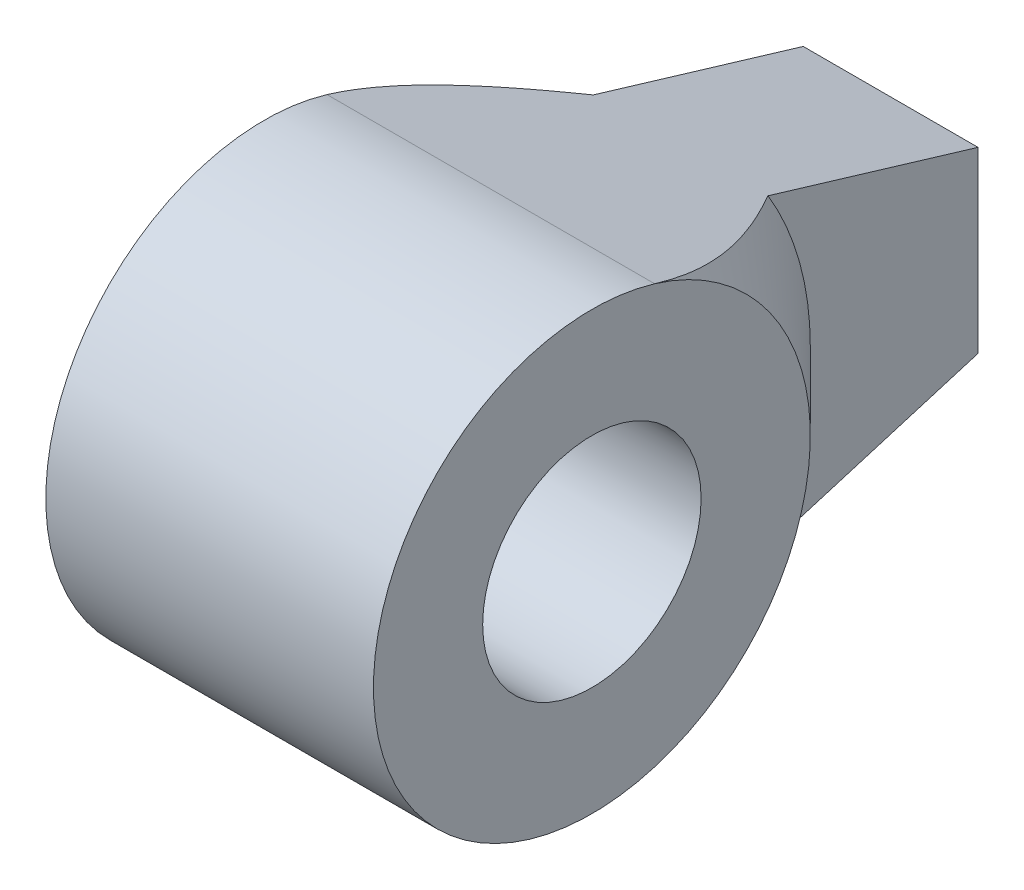
ISO-10303-21;
HEADER;
FILE_DESCRIPTION(('STEP AP214'),'2;1');
FILE_NAME('part.step','',(''),(''),'','','');
FILE_SCHEMA(('AUTOMOTIVE_DESIGN { 1 0 10303 214 1 1 1 1 }'));
ENDSEC;
DATA;
#1=APPLICATION_CONTEXT('core data for automotive mechanical design processes');
#2=APPLICATION_PROTOCOL_DEFINITION('international standard','automotive_design',2000,#1);
#3=PRODUCT_CONTEXT('',#1,'mechanical');
#4=PRODUCT('Part','Part','',(#3));
#5=PRODUCT_RELATED_PRODUCT_CATEGORY('part','',(#4));
#6=PRODUCT_DEFINITION_FORMATION('','',#4);
#7=PRODUCT_DEFINITION_CONTEXT('part definition',#1,'design');
#8=PRODUCT_DEFINITION('design','',#6,#7);
#9=PRODUCT_DEFINITION_SHAPE('','',#8);
#10=(LENGTH_UNIT() NAMED_UNIT(*) SI_UNIT(.MILLI.,.METRE.));
#11=(NAMED_UNIT(*) PLANE_ANGLE_UNIT() SI_UNIT($,.RADIAN.));
#12=(NAMED_UNIT(*) SI_UNIT($,.STERADIAN.) SOLID_ANGLE_UNIT());
#13=UNCERTAINTY_MEASURE_WITH_UNIT(LENGTH_MEASURE(1.E-05),#10,'distance_accuracy_value','');
#14=(GEOMETRIC_REPRESENTATION_CONTEXT(3) GLOBAL_UNCERTAINTY_ASSIGNED_CONTEXT((#13)) GLOBAL_UNIT_ASSIGNED_CONTEXT((#10,
#11,#12)) REPRESENTATION_CONTEXT('',''));
#15=CARTESIAN_POINT('',(0.,0.,0.));
#16=DIRECTION('',(0.,0.,1.));
#17=DIRECTION('',(1.,0.,0.));
#18=AXIS2_PLACEMENT_3D('',#15,#16,#17);
#19=CARTESIAN_POINT('',(8.,0.,0.));
#20=DIRECTION('',(1.,0.,0.));
#21=DIRECTION('',(0.,0.,-1.));
#22=AXIS2_PLACEMENT_3D('',#19,#20,#21);
#23=PLANE('',#22);
#24=DIRECTION('',(0.,-0.287413603137363,-0.957806567492413));
#25=VECTOR('',#24,1.);
#26=CARTESIAN_POINT('',(8.,19.1561313498482,-5.74827206274726));
#27=LINE('',#26,#25);
#28=CARTESIAN_POINT('',(8.,13.9429207671742,-23.1213096618747));
#29=VERTEX_POINT('',#28);
#30=CARTESIAN_POINT('',(8.,8.17227543179107,-42.352));
#31=VERTEX_POINT('',#30);
#32=EDGE_CURVE('E155',#29,#31,#27,.T.);
#33=ORIENTED_EDGE('',*,*,#32,.F.);
#34=CARTESIAN_POINT('',(8.,0.,0.));
#35=DIRECTION('',(1.,0.,0.));
#36=DIRECTION('',(0.,0.,-1.));
#37=AXIS2_PLACEMENT_3D('',#34,#35,#36);
#38=CIRCLE('',#37,27.);
#39=CARTESIAN_POINT('',(8.,-13.9429207671742,-23.1213096618748));
#40=VERTEX_POINT('',#39);
#41=EDGE_CURVE('E192',#29,#40,#38,.F.);
#42=ORIENTED_EDGE('',*,*,#41,.T.);
#43=DIRECTION('',(0.,-0.287413603137363,0.957806567492413));
#44=VECTOR('',#43,1.);
#45=CARTESIAN_POINT('',(8.,-8.17227543179107,-42.352));
#46=LINE('',#45,#44);
#47=CARTESIAN_POINT('',(8.,-8.17227543179107,-42.352));
#48=VERTEX_POINT('',#47);
#49=EDGE_CURVE('E163',#48,#40,#46,.T.);
#50=ORIENTED_EDGE('',*,*,#49,.F.);
#51=DIRECTION('',(0.,1.,0.));
#52=VECTOR('',#51,1.);
#53=CARTESIAN_POINT('',(8.,-8.17227543179107,-42.352));
#54=LINE('',#53,#52);
#55=EDGE_CURVE('E158',#48,#31,#54,.T.);
#56=ORIENTED_EDGE('',*,*,#55,.T.);
#57=EDGE_LOOP('',(#33,#42,#50,#56));
#58=FACE_BOUND('',#57,.T.);
#59=ADVANCED_FACE('F59',(#58),#23,.T.);
#60=CARTESIAN_POINT('',(-8.,0.,0.));
#61=DIRECTION('',(1.,0.,0.));
#62=DIRECTION('',(0.,0.,-1.));
#63=AXIS2_PLACEMENT_3D('',#60,#61,#62);
#64=PLANE('',#63);
#65=DIRECTION('',(0.,-0.287413603137363,0.957806567492413));
#66=VECTOR('',#65,1.);
#67=CARTESIAN_POINT('',(-8.,-8.17227543179107,-42.352));
#68=LINE('',#67,#66);
#69=CARTESIAN_POINT('',(-8.,-8.17227543179107,-42.352));
#70=VERTEX_POINT('',#69);
#71=CARTESIAN_POINT('',(-8.,-13.9429207671743,-23.1213096618746));
#72=VERTEX_POINT('',#71);
#73=EDGE_CURVE('E159',#70,#72,#68,.T.);
#74=ORIENTED_EDGE('',*,*,#73,.T.);
#75=CARTESIAN_POINT('',(-8.,0.,0.));
#76=DIRECTION('',(1.,0.,0.));
#77=DIRECTION('',(0.,0.,-1.));
#78=AXIS2_PLACEMENT_3D('',#75,#76,#77);
#79=CIRCLE('',#78,26.9999999999999);
#80=CARTESIAN_POINT('',(-8.,13.9429207671743,-23.1213096618746));
#81=VERTEX_POINT('',#80);
#82=EDGE_CURVE('E180',#72,#81,#79,.T.);
#83=ORIENTED_EDGE('',*,*,#82,.T.);
#84=DIRECTION('',(0.,-0.287413603137363,-0.957806567492413));
#85=VECTOR('',#84,1.);
#86=CARTESIAN_POINT('',(-8.,19.1561313498482,-5.74827206274726));
#87=LINE('',#86,#85);
#88=CARTESIAN_POINT('',(-8.,8.17227543179107,-42.352));
#89=VERTEX_POINT('',#88);
#90=EDGE_CURVE('E149',#81,#89,#87,.T.);
#91=ORIENTED_EDGE('',*,*,#90,.T.);
#92=DIRECTION('',(0.,1.,0.));
#93=VECTOR('',#92,1.);
#94=CARTESIAN_POINT('',(-8.,-8.17227543179107,-42.352));
#95=LINE('',#94,#93);
#96=EDGE_CURVE('E170',#70,#89,#95,.T.);
#97=ORIENTED_EDGE('',*,*,#96,.F.);
#98=EDGE_LOOP('',(#74,#83,#91,#97));
#99=FACE_BOUND('',#98,.T.);
#100=ADVANCED_FACE('F256',(#99),#64,.F.);
#101=CARTESIAN_POINT('',(8.,19.1561313498482,-5.74827206274726));
#102=DIRECTION('',(0.,0.957806567492413,-0.287413603137363));
#103=DIRECTION('',(0.,0.287413603137363,0.957806567492413));
#104=AXIS2_PLACEMENT_3D('',#101,#102,#103);
#105=PLANE('',#104);
#106=ORIENTED_EDGE('',*,*,#90,.F.);
#107=CARTESIAN_POINT('',(-8.,13.9429207671743,-23.1213096618746));
#108=CARTESIAN_POINT('',(-8.30706429240647,14.0743203145086,-22.6834203343391));
#109=CARTESIAN_POINT('',(-8.6098485003343,14.2065608883528,-22.2427282838087));
#110=CARTESIAN_POINT('',(-9.20521595521464,14.4729822755593,-21.3548783295918));
#111=CARTESIAN_POINT('',(-9.49779594548854,14.6071636893576,-20.907718424951));
#112=CARTESIAN_POINT('',(-10.0725755762302,14.8784244957898,-20.0037410937879));
#113=CARTESIAN_POINT('',(-10.3547053708278,15.0155161630769,-19.5468827619529));
#114=CARTESIAN_POINT('',(-10.904508113177,15.292062156689,-18.6252925309963));
#115=CARTESIAN_POINT('',(-11.1721824161888,15.4315162599102,-18.160561375369));
#116=CARTESIAN_POINT('',(-11.6816370859498,15.7082794335001,-17.2382473915812));
#117=CARTESIAN_POINT('',(-11.9239874259006,15.8455011631569,-16.7809556265663));
#118=CARTESIAN_POINT('',(-12.3897467236119,16.1225667613122,-15.8576338121407));
#119=CARTESIAN_POINT('',(-12.6131541259313,16.2624108439881,-15.3916030489835));
#120=CARTESIAN_POINT('',(-13.2489897856156,16.6855639422139,-13.9814442669659));
#121=CARTESIAN_POINT('',(-13.6283593198275,16.9731948721733,-13.0229134572831));
#122=CARTESIAN_POINT('',(-14.1114646998421,17.4177766019297,-11.5413437058881));
#123=CARTESIAN_POINT('',(-14.2598410318007,17.5707644697891,-11.0315112449925));
#124=CARTESIAN_POINT('',(-14.5192158598474,17.8793702623582,-10.0030816520215));
#125=CARTESIAN_POINT('',(-14.6302206725547,18.0349877379312,-9.48448601669519));
#126=CARTESIAN_POINT('',(-14.7662299853021,18.2711846932733,-8.697359058963));
#127=CARTESIAN_POINT('',(-14.8066867637974,18.3510484634706,-8.43121284053556));
#128=CARTESIAN_POINT('',(-14.8764048521142,18.5111819402621,-7.89756761959931));
#129=CARTESIAN_POINT('',(-14.905666435539,18.5914516368872,-7.63006865031276));
#130=CARTESIAN_POINT('',(-14.9526678900106,18.7523797565489,-7.09377527997941));
#131=CARTESIAN_POINT('',(-14.9703919726669,18.8330385607349,-6.82497960875116));
#132=CARTESIAN_POINT('',(-14.9940712806719,18.9945078794712,-6.28688269111763));
#133=CARTESIAN_POINT('',(-15.0000251276921,19.0753184106803,-6.01758138919712));
#134=CARTESIAN_POINT('',(-15.0000000000001,19.1561313498482,-5.74827206274727));
#135=B_SPLINE_CURVE_WITH_KNOTS('',3,(#107,#108,#109,#110,#111,#112,#113,#114,#115,#116,#117,
#118,#119,#120,#121,#122,#123,#124,#125,#126,#127,#128,#129,#130,#131,#132,#133,#134),
.UNSPECIFIED.,.F.,.F.,(4,2,2,2,2,2,2,2,2,2,2,2,2,4),(0.,1.65222291840313,3.30496840668106,
4.96727550771535,6.62942648928656,8.23527712809539,9.84125949896086,13.0449150205177,
14.701633810279,16.3580724369127,17.2002860278251,18.0424790342729,18.8858221228902,
19.7292639635671),.UNSPECIFIED.);
#136=CARTESIAN_POINT('',(-15.,19.1561313498482,-5.74827206274726));
#137=VERTEX_POINT('',#136);
#138=EDGE_CURVE('E203',#81,#137,#135,.T.);
#139=ORIENTED_EDGE('',*,*,#138,.T.);
#140=DIRECTION('',(-1.,0.,0.));
#141=VECTOR('',#140,1.);
#142=CARTESIAN_POINT('',(8.,19.1561313498482,-5.74827206274726));
#143=LINE('',#142,#141);
#144=CARTESIAN_POINT('',(15.,19.1561313498482,-5.74827206274726));
#145=VERTEX_POINT('',#144);
#146=EDGE_CURVE('E177',#145,#137,#143,.T.);
#147=ORIENTED_EDGE('',*,*,#146,.F.);
#148=CARTESIAN_POINT('',(15.,19.1561313498482,-5.74827206274726));
#149=CARTESIAN_POINT('',(15.0000358357359,19.0677422457137,-6.04282897832373));
#150=CARTESIAN_POINT('',(14.9929077189458,18.9793566684735,-6.33737414051576));
#151=CARTESIAN_POINT('',(14.9645898778661,18.8027857745317,-6.92579709614252));
#152=CARTESIAN_POINT('',(14.9434024555946,18.7146004274167,-7.21967499093003));
#153=CARTESIAN_POINT('',(14.8872859080639,18.5387626257111,-7.80565491480524));
#154=CARTESIAN_POINT('',(14.8523831686565,18.4511094741284,-8.09775926662019));
#155=CARTESIAN_POINT('',(14.7693393731644,18.2763260932542,-8.68022533037796));
#156=CARTESIAN_POINT('',(14.7211978739816,18.189195881565,-8.97058698366067));
#157=CARTESIAN_POINT('',(14.5597122685248,17.931812521403,-9.82831768963776));
#158=CARTESIAN_POINT('',(14.4282760654907,17.7624769766191,-10.3926288256924));
#159=CARTESIAN_POINT('',(14.1223859214282,17.4270448989263,-11.5104570824441));
#160=CARTESIAN_POINT('',(13.9479166270376,17.2609495449268,-12.0639702744227));
#161=CARTESIAN_POINT('',(13.5922643436737,16.9578814265131,-13.0739455541089));
#162=CARTESIAN_POINT('',(13.4163356798463,16.8203932370042,-13.5321252972621));
#163=CARTESIAN_POINT('',(13.0418851780683,16.5479667363471,-14.4399873074107));
#164=CARTESIAN_POINT('',(12.8433592809747,16.4130288884091,-14.8896680307569));
#165=CARTESIAN_POINT('',(12.4267030020832,16.1454508731659,-15.7813724508642));
#166=CARTESIAN_POINT('',(12.2085440142716,16.0128144057159,-16.2233838178483));
#167=CARTESIAN_POINT('',(11.7557129780189,15.7498879776708,-17.0995868117219));
#168=CARTESIAN_POINT('',(11.521039635091,15.6195982020299,-17.5337778222507));
#169=CARTESIAN_POINT('',(11.029879314061,15.3570526396449,-18.4087115803378));
#170=CARTESIAN_POINT('',(10.7729340067146,15.2248679212645,-18.8492174923924));
#171=CARTESIAN_POINT('',(10.2462992617282,14.9626056310263,-19.7232072453257));
#172=CARTESIAN_POINT('',(9.97660885381159,14.8325282206122,-20.1566905481934));
#173=CARTESIAN_POINT('',(9.42763181240657,14.5748703604827,-21.0153360260141));
#174=CARTESIAN_POINT('',(9.14839401114667,14.4472812878151,-21.4405269369775));
#175=CARTESIAN_POINT('',(8.5807319380201,14.1938477443786,-22.2850948686157));
#176=CARTESIAN_POINT('',(8.29231008038402,14.0680028274024,-22.7044733762771));
#177=CARTESIAN_POINT('',(8.,13.9429207671742,-23.1213096618748));
#178=B_SPLINE_CURVE_WITH_KNOTS('',3,(#148,#149,#150,#151,#152,#153,#154,#155,#156,#157,#158,
#159,#160,#161,#162,#163,#164,#165,#166,#167,#168,#169,#170,#171,#172,#173,#174,#175,#176,#177),
.UNSPECIFIED.,.F.,.F.,(4,2,2,2,2,2,2,2,2,2,2,2,2,2,4),(0.,0.922495392104375,1.84483977552467,
2.76541835043034,3.68602774061943,5.49495380456712,7.30452619375949,8.83295844532619,
10.3616656838822,11.8926375175241,13.4237294911912,15.00395167001,16.5842943445695,
18.1575007775979,19.7302970184835),.UNSPECIFIED.);
#179=EDGE_CURVE('E12',#145,#29,#178,.T.);
#180=ORIENTED_EDGE('',*,*,#179,.T.);
#181=ORIENTED_EDGE('',*,*,#32,.T.);
#182=DIRECTION('',(-1.,0.,0.));
#183=VECTOR('',#182,1.);
#184=CARTESIAN_POINT('',(8.,8.17227543179107,-42.352));
#185=LINE('',#184,#183);
#186=EDGE_CURVE('E167',#31,#89,#185,.T.);
#187=ORIENTED_EDGE('',*,*,#186,.T.);
#188=EDGE_LOOP('',(#106,#139,#147,#180,#181,#187));
#189=FACE_BOUND('',#188,.T.);
#190=ADVANCED_FACE('F231',(#189),#105,.T.);
#191=CARTESIAN_POINT('',(8.,0.,0.));
#192=DIRECTION('',(-1.,0.,0.));
#193=DIRECTION('',(0.,0.,1.));
#194=AXIS2_PLACEMENT_3D('',#191,#192,#193);
#195=CYLINDRICAL_SURFACE('',#194,20.);
#196=CARTESIAN_POINT('',(-15.,0.,0.));
#197=DIRECTION('',(1.,0.,0.));
#198=DIRECTION('',(0.,0.,-1.));
#199=AXIS2_PLACEMENT_3D('',#196,#197,#198);
#200=CIRCLE('',#199,20.);
#201=CARTESIAN_POINT('',(-15.,-19.1561313498482,-5.74827206274727));
#202=VERTEX_POINT('',#201);
#203=EDGE_CURVE('E151',#137,#202,#200,.T.);
#204=ORIENTED_EDGE('',*,*,#203,.T.);
#205=DIRECTION('',(-1.,0.,0.));
#206=VECTOR('',#205,1.);
#207=CARTESIAN_POINT('',(8.,-19.1561313498482,-5.74827206274727));
#208=LINE('',#207,#206);
#209=CARTESIAN_POINT('',(15.,-19.1561313498482,-5.74827206274727));
#210=VERTEX_POINT('',#209);
#211=EDGE_CURVE('E181',#210,#202,#208,.T.);
#212=ORIENTED_EDGE('',*,*,#211,.F.);
#213=CARTESIAN_POINT('',(15.,0.,0.));
#214=DIRECTION('',(1.,0.,0.));
#215=DIRECTION('',(0.,0.,-1.));
#216=AXIS2_PLACEMENT_3D('',#213,#214,#215);
#217=CIRCLE('',#216,20.);
#218=EDGE_CURVE('E145',#145,#210,#217,.T.);
#219=ORIENTED_EDGE('',*,*,#218,.F.);
#220=ORIENTED_EDGE('',*,*,#146,.T.);
#221=EDGE_LOOP('',(#204,#212,#219,#220));
#222=FACE_BOUND('',#221,.T.);
#223=ADVANCED_FACE('F217',(#222),#195,.T.);
#224=CARTESIAN_POINT('',(8.,-8.17227543179107,-42.352));
#225=DIRECTION('',(0.,-0.957806567492413,-0.287413603137363));
#226=DIRECTION('',(0.,0.287413603137363,-0.957806567492413));
#227=AXIS2_PLACEMENT_3D('',#224,#225,#226);
#228=PLANE('',#227);
#229=ORIENTED_EDGE('',*,*,#73,.F.);
#230=DIRECTION('',(-1.,0.,0.));
#231=VECTOR('',#230,1.);
#232=CARTESIAN_POINT('',(8.,-8.17227543179107,-42.352));
#233=LINE('',#232,#231);
#234=EDGE_CURVE('E184',#48,#70,#233,.T.);
#235=ORIENTED_EDGE('',*,*,#234,.F.);
#236=ORIENTED_EDGE('',*,*,#49,.T.);
#237=CARTESIAN_POINT('',(8.,-13.9429207671742,-23.1213096618748));
#238=CARTESIAN_POINT('',(8.30706429240647,-14.0743203145086,-22.6834203343392));
#239=CARTESIAN_POINT('',(8.6098485003343,-14.2065608883528,-22.2427282838087));
#240=CARTESIAN_POINT('',(9.20521595521464,-14.4729822755593,-21.3548783295918));
#241=CARTESIAN_POINT('',(9.49779594548854,-14.6071636893575,-20.9077184249511));
#242=CARTESIAN_POINT('',(10.0725755762302,-14.8784244957898,-20.0037410937879));
#243=CARTESIAN_POINT('',(10.3547053708278,-15.0155161630768,-19.5468827619529));
#244=CARTESIAN_POINT('',(10.9045081131771,-15.292062156689,-18.6252925309963));
#245=CARTESIAN_POINT('',(11.1721824161888,-15.4315162599102,-18.160561375369));
#246=CARTESIAN_POINT('',(11.6816370859498,-15.7082794335001,-17.2382473915811));
#247=CARTESIAN_POINT('',(11.9239874259006,-15.8455011631569,-16.7809556265662));
#248=CARTESIAN_POINT('',(12.3897467236119,-16.1225667613122,-15.8576338121407));
#249=CARTESIAN_POINT('',(12.6131541259314,-16.2624108439881,-15.3916030489834));
#250=CARTESIAN_POINT('',(13.2489897856156,-16.685563942214,-13.9814442669657));
#251=CARTESIAN_POINT('',(13.6283593198275,-16.9731948721734,-13.022913457283));
#252=CARTESIAN_POINT('',(14.1114646998421,-17.4177766019298,-11.5413437058879));
#253=CARTESIAN_POINT('',(14.2598410318007,-17.5707644697891,-11.0315112449924));
#254=CARTESIAN_POINT('',(14.5192158598474,-17.8793702623582,-10.0030816520214));
#255=CARTESIAN_POINT('',(14.6302206725547,-18.0349877379313,-9.48448601669509));
#256=CARTESIAN_POINT('',(14.766229985302,-18.2711846932733,-8.69735905896293));
#257=CARTESIAN_POINT('',(14.8066867637973,-18.3510484634706,-8.43121284053549));
#258=CARTESIAN_POINT('',(14.8764048521141,-18.5111819402621,-7.89756761959925));
#259=CARTESIAN_POINT('',(14.9056664355389,-18.5914516368872,-7.63006865031271));
#260=CARTESIAN_POINT('',(14.9526678900105,-18.7523797565489,-7.09377527997938));
#261=CARTESIAN_POINT('',(14.9703919726668,-18.8330385607349,-6.82497960875114));
#262=CARTESIAN_POINT('',(14.9940712806718,-18.9945078794712,-6.28688269111762));
#263=CARTESIAN_POINT('',(15.000025127692,-19.0753184106803,-6.01758138919712));
#264=CARTESIAN_POINT('',(15.,-19.1561313498482,-5.74827206274727));
#265=B_SPLINE_CURVE_WITH_KNOTS('',3,(#237,#238,#239,#240,#241,#242,#243,#244,#245,#246,#247,
#248,#249,#250,#251,#252,#253,#254,#255,#256,#257,#258,#259,#260,#261,#262,#263,#264),
.UNSPECIFIED.,.F.,.F.,(4,2,2,2,2,2,2,2,2,2,2,2,2,4),(0.,1.65222291840317,3.30496840668112,
4.96727550771544,6.62942648928669,8.23527712809554,9.84125949896105,13.044915020518,
14.7016338102793,16.3580724369128,17.2002860278252,18.042479034273,18.8858221228902,
19.7292639635671),.UNSPECIFIED.);
#266=EDGE_CURVE('E75',#40,#210,#265,.T.);
#267=ORIENTED_EDGE('',*,*,#266,.T.);
#268=ORIENTED_EDGE('',*,*,#211,.T.);
#269=CARTESIAN_POINT('',(-15.0000000000001,-19.1561313498482,-5.74827206274727));
#270=CARTESIAN_POINT('',(-15.000035835736,-19.0677422457137,-6.04282897832373));
#271=CARTESIAN_POINT('',(-14.9929077189458,-18.9793566684735,-6.33737414051575));
#272=CARTESIAN_POINT('',(-14.9645898778662,-18.8027857745317,-6.9257970961425));
#273=CARTESIAN_POINT('',(-14.9434024555947,-18.7146004274167,-7.21967499093001));
#274=CARTESIAN_POINT('',(-14.8872859080639,-18.5387626257111,-7.80565491480521));
#275=CARTESIAN_POINT('',(-14.8523831686566,-18.4511094741284,-8.09775926662015));
#276=CARTESIAN_POINT('',(-14.7693393731645,-18.2763260932542,-8.68022533037791));
#277=CARTESIAN_POINT('',(-14.7211978739817,-18.189195881565,-8.97058698366061));
#278=CARTESIAN_POINT('',(-14.5597122685249,-17.9318125214031,-9.82831768963768));
#279=CARTESIAN_POINT('',(-14.4282760654907,-17.7624769766191,-10.3926288256923));
#280=CARTESIAN_POINT('',(-14.1223859214283,-17.4270448989263,-11.510457082444));
#281=CARTESIAN_POINT('',(-13.9479166270377,-17.2609495449269,-12.0639702744226));
#282=CARTESIAN_POINT('',(-13.5922643436738,-16.9578814265131,-13.0739455541087));
#283=CARTESIAN_POINT('',(-13.4163356798464,-16.8203932370043,-13.5321252972619));
#284=CARTESIAN_POINT('',(-13.0418851780684,-16.5479667363472,-14.4399873074106));
#285=CARTESIAN_POINT('',(-12.8433592809748,-16.4130288884091,-14.8896680307568));
#286=CARTESIAN_POINT('',(-12.4267030020833,-16.1454508731659,-15.7813724508641));
#287=CARTESIAN_POINT('',(-12.2085440142717,-16.0128144057159,-16.2233838178482));
#288=CARTESIAN_POINT('',(-11.755712978019,-15.7498879776708,-17.0995868117218));
#289=CARTESIAN_POINT('',(-11.5210396350911,-15.6195982020299,-17.5337778222506));
#290=CARTESIAN_POINT('',(-11.0298793140611,-15.3570526396449,-18.4087115803377));
#291=CARTESIAN_POINT('',(-10.7729340067147,-15.2248679212645,-18.8492174923922));
#292=CARTESIAN_POINT('',(-10.2462992617283,-14.9626056310264,-19.7232072453256));
#293=CARTESIAN_POINT('',(-9.97660885381163,-14.8325282206122,-20.1566905481933));
#294=CARTESIAN_POINT('',(-9.4276318124066,-14.5748703604827,-21.015336026014));
#295=CARTESIAN_POINT('',(-9.1483940111467,-14.4472812878152,-21.4405269369774));
#296=CARTESIAN_POINT('',(-8.58073193802011,-14.1938477443786,-22.2850948686156));
#297=CARTESIAN_POINT('',(-8.29231008038403,-14.0680028274024,-22.704473376277));
#298=CARTESIAN_POINT('',(-8.,-13.9429207671743,-23.1213096618746));
#299=B_SPLINE_CURVE_WITH_KNOTS('',3,(#269,#270,#271,#272,#273,#274,#275,#276,#277,#278,#279,
#280,#281,#282,#283,#284,#285,#286,#287,#288,#289,#290,#291,#292,#293,#294,#295,#296,#297,#298),
.UNSPECIFIED.,.F.,.F.,(4,2,2,2,2,2,2,2,2,2,2,2,2,2,4),(0.,0.922495392104356,1.84483977552464,
2.76541835043029,3.68602774061936,5.49495380456701,7.30452619375935,8.83295844532605,
10.3616656838821,11.892637517524,13.4237294911911,15.0039516700099,16.5842943445694,
18.1575007775978,19.7302970184834),.UNSPECIFIED.);
#300=EDGE_CURVE('E195',#202,#72,#299,.T.);
#301=ORIENTED_EDGE('',*,*,#300,.T.);
#302=EDGE_LOOP('',(#229,#235,#236,#267,#268,#301));
#303=FACE_BOUND('',#302,.T.);
#304=ADVANCED_FACE('F211',(#303),#228,.T.);
#305=CARTESIAN_POINT('',(8.,-8.17227543179107,-42.352));
#306=DIRECTION('',(0.,0.,1.));
#307=DIRECTION('',(1.,0.,0.));
#308=AXIS2_PLACEMENT_3D('',#305,#306,#307);
#309=PLANE('',#308);
#310=CARTESIAN_POINT('',(0.,0.,-42.352));
#311=DIRECTION('',(0.,0.,-1.));
#312=DIRECTION('',(-1.,0.,0.));
#313=AXIS2_PLACEMENT_3D('',#310,#311,#312);
#314=CIRCLE('',#313,5.75436999999999);
#315=CARTESIAN_POINT('',(-5.75436999999999,0.,-42.352));
#316=VERTEX_POINT('',#315);
#317=EDGE_CURVE('E131',#316,#316,#314,.T.);
#318=ORIENTED_EDGE('',*,*,#317,.F.);
#319=EDGE_LOOP('',(#318));
#320=FACE_BOUND('',#319,.T.);
#321=ORIENTED_EDGE('',*,*,#96,.T.);
#322=ORIENTED_EDGE('',*,*,#186,.F.);
#323=ORIENTED_EDGE('',*,*,#55,.F.);
#324=ORIENTED_EDGE('',*,*,#234,.T.);
#325=EDGE_LOOP('',(#321,#322,#323,#324));
#326=FACE_BOUND('',#325,.T.);
#327=ADVANCED_FACE('F216',(#320,#326),#309,.F.);
#328=CARTESIAN_POINT('',(-15.,0.,0.));
#329=DIRECTION('',(1.,0.,0.));
#330=DIRECTION('',(0.,0.,-1.));
#331=AXIS2_PLACEMENT_3D('',#328,#329,#330);
#332=PLANE('',#331);
#333=ORIENTED_EDGE('',*,*,#203,.F.);
#334=EDGE_CURVE('E143',#202,#137,#200,.T.);
#335=ORIENTED_EDGE('',*,*,#334,.F.);
#336=EDGE_LOOP('',(#333,#335));
#337=FACE_BOUND('',#336,.T.);
#338=CARTESIAN_POINT('',(-15.,0.,0.));
#339=DIRECTION('',(1.,0.,0.));
#340=DIRECTION('',(0.,0.,-1.));
#341=AXIS2_PLACEMENT_3D('',#338,#339,#340);
#342=CIRCLE('',#341,10.);
#343=CARTESIAN_POINT('',(-15.,0.,-10.));
#344=VERTEX_POINT('',#343);
#345=EDGE_CURVE('E130',#344,#344,#342,.T.);
#346=ORIENTED_EDGE('',*,*,#345,.T.);
#347=EDGE_LOOP('',(#346));
#348=FACE_BOUND('',#347,.T.);
#349=ADVANCED_FACE('F238',(#337,#348),#332,.F.);
#350=CARTESIAN_POINT('',(8.,0.,0.));
#351=DIRECTION('',(-1.,0.,0.));
#352=DIRECTION('',(0.,0.,1.));
#353=AXIS2_PLACEMENT_3D('',#350,#351,#352);
#354=CYLINDRICAL_SURFACE('',#353,10.);
#355=ORIENTED_EDGE('',*,*,#345,.F.);
#356=EDGE_LOOP('',(#355));
#357=FACE_BOUND('',#356,.T.);
#358=CARTESIAN_POINT('',(15.,0.,0.));
#359=DIRECTION('',(1.,0.,0.));
#360=DIRECTION('',(0.,0.,-1.));
#361=AXIS2_PLACEMENT_3D('',#358,#359,#360);
#362=CIRCLE('',#361,10.);
#363=CARTESIAN_POINT('',(15.,0.,-10.));
#364=VERTEX_POINT('',#363);
#365=EDGE_CURVE('E136',#364,#364,#362,.T.);
#366=ORIENTED_EDGE('',*,*,#365,.T.);
#367=EDGE_LOOP('',(#366));
#368=FACE_BOUND('',#367,.T.);
#369=ADVANCED_FACE('F264',(#357,#368),#354,.F.);
#370=CARTESIAN_POINT('',(15.,0.,0.));
#371=DIRECTION('',(1.,0.,0.));
#372=DIRECTION('',(0.,0.,-1.));
#373=AXIS2_PLACEMENT_3D('',#370,#371,#372);
#374=PLANE('',#373);
#375=ORIENTED_EDGE('',*,*,#218,.T.);
#376=EDGE_CURVE('E150',#210,#145,#217,.T.);
#377=ORIENTED_EDGE('',*,*,#376,.T.);
#378=EDGE_LOOP('',(#375,#377));
#379=FACE_BOUND('',#378,.T.);
#380=ORIENTED_EDGE('',*,*,#365,.F.);
#381=EDGE_LOOP('',(#380));
#382=FACE_BOUND('',#381,.T.);
#383=ADVANCED_FACE('F246',(#379,#382),#374,.T.);
#384=CARTESIAN_POINT('',(-15.0000000000001,0.,0.));
#385=DIRECTION('',(1.,0.,0.));
#386=DIRECTION('',(0.,0.,-1.));
#387=AXIS2_PLACEMENT_3D('',#384,#385,#386);
#388=CONICAL_SURFACE('',#387,20.,0.785398163397442);
#389=ORIENTED_EDGE('',*,*,#138,.F.);
#390=ORIENTED_EDGE('',*,*,#82,.F.);
#391=ORIENTED_EDGE('',*,*,#300,.F.);
#392=ORIENTED_EDGE('',*,*,#334,.T.);
#393=EDGE_LOOP('',(#389,#390,#391,#392));
#394=FACE_BOUND('',#393,.T.);
#395=ADVANCED_FACE('F209',(#394),#388,.T.);
#396=CARTESIAN_POINT('',(8.,0.,0.));
#397=DIRECTION('',(-1.,0.,0.));
#398=DIRECTION('',(0.,0.,1.));
#399=AXIS2_PLACEMENT_3D('',#396,#397,#398);
#400=CONICAL_SURFACE('',#399,27.,0.785398163397453);
#401=ORIENTED_EDGE('',*,*,#179,.F.);
#402=ORIENTED_EDGE('',*,*,#376,.F.);
#403=ORIENTED_EDGE('',*,*,#266,.F.);
#404=ORIENTED_EDGE('',*,*,#41,.F.);
#405=EDGE_LOOP('',(#401,#402,#403,#404));
#406=FACE_BOUND('',#405,.T.);
#407=ADVANCED_FACE('F62',(#406),#400,.T.);
#408=CARTESIAN_POINT('',(0.,0.,-20.));
#409=DIRECTION('',(0.,0.,-1.));
#410=DIRECTION('',(-1.,0.,0.));
#411=AXIS2_PLACEMENT_3D('',#408,#409,#410);
#412=CONICAL_SURFACE('',#411,5.75436999999999,1.02974425867665);
#413=CARTESIAN_POINT('',(0.,0.,-16.5424256796864));
#414=VERTEX_POINT('',#413);
#415=VERTEX_LOOP('',#414);
#416=FACE_BOUND('',#415,.T.);
#417=CARTESIAN_POINT('',(0.,0.,-20.));
#418=DIRECTION('',(0.,0.,-1.));
#419=DIRECTION('',(-1.,0.,0.));
#420=AXIS2_PLACEMENT_3D('',#417,#418,#419);
#421=CIRCLE('',#420,5.75436999999999);
#422=CARTESIAN_POINT('',(-5.75436999999999,0.,-20.));
#423=VERTEX_POINT('',#422);
#424=EDGE_CURVE('E127',#423,#423,#421,.T.);
#425=ORIENTED_EDGE('',*,*,#424,.T.);
#426=EDGE_LOOP('',(#425));
#427=FACE_BOUND('',#426,.T.);
#428=ADVANCED_FACE('F120',(#416,#427),#412,.F.);
#429=CARTESIAN_POINT('',(0.,0.,-42.352));
#430=DIRECTION('',(0.,0.,-1.));
#431=DIRECTION('',(-1.,0.,0.));
#432=AXIS2_PLACEMENT_3D('',#429,#430,#431);
#433=CYLINDRICAL_SURFACE('',#432,5.75436999999999);
#434=ORIENTED_EDGE('',*,*,#424,.F.);
#435=EDGE_LOOP('',(#434));
#436=FACE_BOUND('',#435,.T.);
#437=ORIENTED_EDGE('',*,*,#317,.T.);
#438=EDGE_LOOP('',(#437));
#439=FACE_BOUND('',#438,.T.);
#440=ADVANCED_FACE('F123',(#436,#439),#433,.F.);
#441=CLOSED_SHELL('',(#59,#100,#190,#223,#304,#327,#349,#369,#383,#395,#407,#428,#440));
#442=MANIFOLD_SOLID_BREP('B2',#441);
#443=ADVANCED_BREP_SHAPE_REPRESENTATION('',(#18,#442),#14);
#444=SHAPE_DEFINITION_REPRESENTATION(#9,#443);
ENDSEC;
END-ISO-10303-21;
